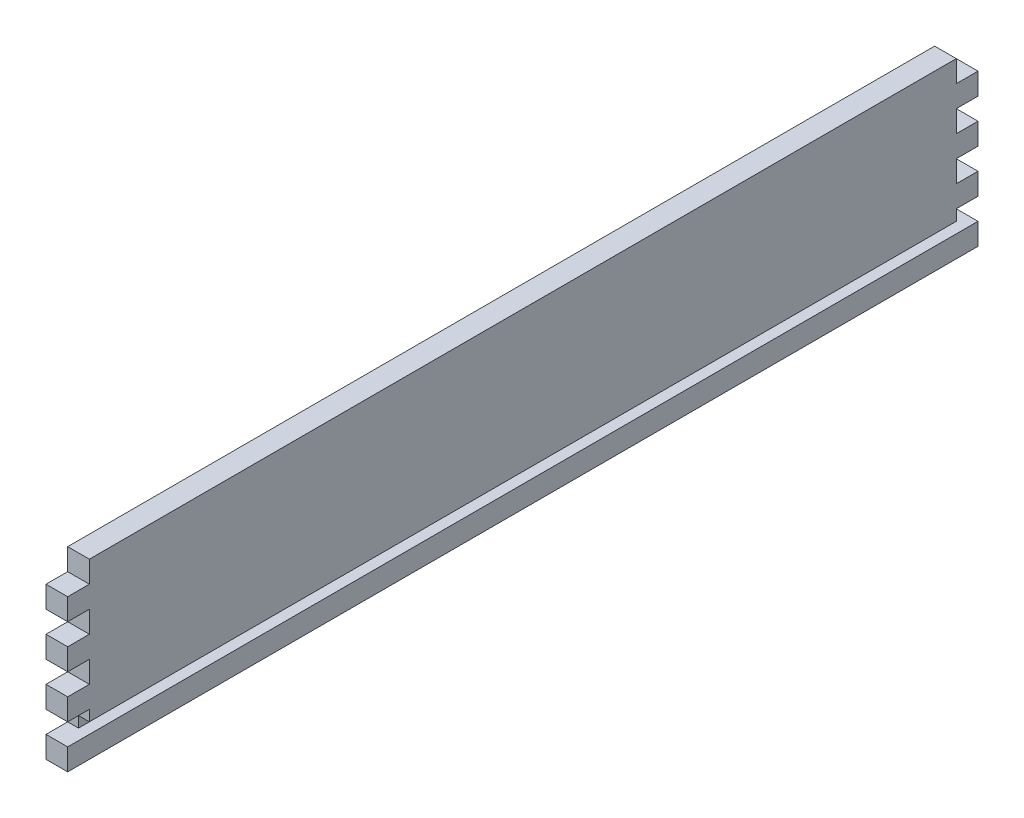
ISO-10303-21;
HEADER;
FILE_DESCRIPTION(('STEP AP214'),'2;1');
FILE_NAME('part.step','',(''),(''),'','','');
FILE_SCHEMA(('AUTOMOTIVE_DESIGN { 1 0 10303 214 1 1 1 1 }'));
ENDSEC;
DATA;
#1=APPLICATION_CONTEXT('core data for automotive mechanical design processes');
#2=APPLICATION_PROTOCOL_DEFINITION('international standard','automotive_design',2000,#1);
#3=PRODUCT_CONTEXT('',#1,'mechanical');
#4=PRODUCT('Part','Part','',(#3));
#5=PRODUCT_RELATED_PRODUCT_CATEGORY('part','',(#4));
#6=PRODUCT_DEFINITION_FORMATION('','',#4);
#7=PRODUCT_DEFINITION_CONTEXT('part definition',#1,'design');
#8=PRODUCT_DEFINITION('design','',#6,#7);
#9=PRODUCT_DEFINITION_SHAPE('','',#8);
#10=(LENGTH_UNIT() NAMED_UNIT(*) SI_UNIT(.MILLI.,.METRE.));
#11=(NAMED_UNIT(*) PLANE_ANGLE_UNIT() SI_UNIT($,.RADIAN.));
#12=(NAMED_UNIT(*) SI_UNIT($,.STERADIAN.) SOLID_ANGLE_UNIT());
#13=UNCERTAINTY_MEASURE_WITH_UNIT(LENGTH_MEASURE(1.E-05),#10,'distance_accuracy_value','');
#14=(GEOMETRIC_REPRESENTATION_CONTEXT(3) GLOBAL_UNCERTAINTY_ASSIGNED_CONTEXT((#13)) GLOBAL_UNIT_ASSIGNED_CONTEXT((#10,
#11,#12)) REPRESENTATION_CONTEXT('',''));
#15=CARTESIAN_POINT('',(0.,0.,0.));
#16=DIRECTION('',(0.,0.,1.));
#17=DIRECTION('',(1.,0.,0.));
#18=AXIS2_PLACEMENT_3D('',#15,#16,#17);
#19=CARTESIAN_POINT('',(12.7,0.,0.));
#20=DIRECTION('',(1.,0.,0.));
#21=DIRECTION('',(0.,0.,-1.));
#22=AXIS2_PLACEMENT_3D('',#19,#20,#21);
#23=PLANE('',#22);
#24=DIRECTION('',(0.,0.,1.));
#25=VECTOR('',#24,1.);
#26=CARTESIAN_POINT('',(12.7,19.05,0.));
#27=LINE('',#26,#25);
#28=CARTESIAN_POINT('',(12.7,19.05,-520.700000000001));
#29=VERTEX_POINT('',#28);
#30=CARTESIAN_POINT('',(12.7,19.05,-12.7000000000007));
#31=VERTEX_POINT('',#30);
#32=EDGE_CURVE('E42',#29,#31,#27,.T.);
#33=ORIENTED_EDGE('',*,*,#32,.F.);
#34=DIRECTION('',(0.,-1.,0.));
#35=VECTOR('',#34,1.);
#36=CARTESIAN_POINT('',(12.7,4.55191440096315E-12,-520.700000000001));
#37=LINE('',#36,#35);
#38=CARTESIAN_POINT('',(12.7,25.4,-520.700000000001));
#39=VERTEX_POINT('',#38);
#40=EDGE_CURVE('E270',#39,#29,#37,.T.);
#41=ORIENTED_EDGE('',*,*,#40,.F.);
#42=DIRECTION('',(0.,0.,-1.));
#43=VECTOR('',#42,1.);
#44=CARTESIAN_POINT('',(12.7,25.4,0.));
#45=LINE('',#44,#43);
#46=CARTESIAN_POINT('',(12.7,25.4,-533.400000000001));
#47=VERTEX_POINT('',#46);
#48=EDGE_CURVE('E363',#39,#47,#45,.T.);
#49=ORIENTED_EDGE('',*,*,#48,.T.);
#50=DIRECTION('',(0.,1.,0.));
#51=VECTOR('',#50,1.);
#52=CARTESIAN_POINT('',(12.7,4.66293670342566E-12,-533.400000000001));
#53=LINE('',#52,#51);
#54=CARTESIAN_POINT('',(12.7,38.1,-533.400000000001));
#55=VERTEX_POINT('',#54);
#56=EDGE_CURVE('E163',#47,#55,#53,.T.);
#57=ORIENTED_EDGE('',*,*,#56,.T.);
#58=DIRECTION('',(0.,0.,-1.));
#59=VECTOR('',#58,1.);
#60=CARTESIAN_POINT('',(12.7,38.1,0.));
#61=LINE('',#60,#59);
#62=CARTESIAN_POINT('',(12.7,38.1,-520.700000000001));
#63=VERTEX_POINT('',#62);
#64=EDGE_CURVE('E602',#63,#55,#61,.T.);
#65=ORIENTED_EDGE('',*,*,#64,.F.);
#66=DIRECTION('',(0.,-1.,0.));
#67=VECTOR('',#66,1.);
#68=CARTESIAN_POINT('',(12.7,4.55191440096315E-12,-520.700000000001));
#69=LINE('',#68,#67);
#70=CARTESIAN_POINT('',(12.7,50.8,-520.7));
#71=VERTEX_POINT('',#70);
#72=EDGE_CURVE('E596',#71,#63,#69,.T.);
#73=ORIENTED_EDGE('',*,*,#72,.F.);
#74=DIRECTION('',(0.,0.,-1.));
#75=VECTOR('',#74,1.);
#76=CARTESIAN_POINT('',(12.7,50.8,0.));
#77=LINE('',#76,#75);
#78=CARTESIAN_POINT('',(12.7,50.8,-533.4));
#79=VERTEX_POINT('',#78);
#80=EDGE_CURVE('E591',#71,#79,#77,.T.);
#81=ORIENTED_EDGE('',*,*,#80,.T.);
#82=DIRECTION('',(0.,1.,0.));
#83=VECTOR('',#82,1.);
#84=CARTESIAN_POINT('',(12.7,9.32587340685134E-12,-533.400000000001));
#85=LINE('',#84,#83);
#86=CARTESIAN_POINT('',(12.7,63.5,-533.4));
#87=VERTEX_POINT('',#86);
#88=EDGE_CURVE('E587',#79,#87,#85,.T.);
#89=ORIENTED_EDGE('',*,*,#88,.T.);
#90=DIRECTION('',(0.,0.,-1.));
#91=VECTOR('',#90,1.);
#92=CARTESIAN_POINT('',(12.7,63.5,0.));
#93=LINE('',#92,#91);
#94=CARTESIAN_POINT('',(12.7,63.5,-520.7));
#95=VERTEX_POINT('',#94);
#96=EDGE_CURVE('E651',#95,#87,#93,.T.);
#97=ORIENTED_EDGE('',*,*,#96,.F.);
#98=DIRECTION('',(0.,-1.,0.));
#99=VECTOR('',#98,1.);
#100=CARTESIAN_POINT('',(12.7,4.55191440096315E-12,-520.700000000001));
#101=LINE('',#100,#99);
#102=CARTESIAN_POINT('',(12.7,76.2,-520.7));
#103=VERTEX_POINT('',#102);
#104=EDGE_CURVE('E574',#103,#95,#101,.T.);
#105=ORIENTED_EDGE('',*,*,#104,.F.);
#106=DIRECTION('',(0.,0.,-1.));
#107=VECTOR('',#106,1.);
#108=CARTESIAN_POINT('',(12.7,76.2,0.));
#109=LINE('',#108,#107);
#110=CARTESIAN_POINT('',(12.7,76.2,-533.4));
#111=VERTEX_POINT('',#110);
#112=EDGE_CURVE('E654',#103,#111,#109,.T.);
#113=ORIENTED_EDGE('',*,*,#112,.T.);
#114=DIRECTION('',(0.,1.,0.));
#115=VECTOR('',#114,1.);
#116=CARTESIAN_POINT('',(12.7,4.66293670342566E-12,-533.400000000001));
#117=LINE('',#116,#115);
#118=CARTESIAN_POINT('',(12.7,88.9,-533.4));
#119=VERTEX_POINT('',#118);
#120=EDGE_CURVE('E656',#111,#119,#117,.T.);
#121=ORIENTED_EDGE('',*,*,#120,.T.);
#122=DIRECTION('',(0.,0.,-1.));
#123=VECTOR('',#122,1.);
#124=CARTESIAN_POINT('',(12.7,88.9,0.));
#125=LINE('',#124,#123);
#126=CARTESIAN_POINT('',(12.7,88.9,-520.7));
#127=VERTEX_POINT('',#126);
#128=EDGE_CURVE('E560',#127,#119,#125,.T.);
#129=ORIENTED_EDGE('',*,*,#128,.F.);
#130=DIRECTION('',(0.,-1.,0.));
#131=VECTOR('',#130,1.);
#132=CARTESIAN_POINT('',(12.7,0.,-520.7));
#133=LINE('',#132,#131);
#134=CARTESIAN_POINT('',(12.7,101.6,-520.7));
#135=VERTEX_POINT('',#134);
#136=EDGE_CURVE('E554',#135,#127,#133,.T.);
#137=ORIENTED_EDGE('',*,*,#136,.F.);
#138=DIRECTION('',(0.,0.,-1.));
#139=VECTOR('',#138,1.);
#140=CARTESIAN_POINT('',(12.7,101.6,0.));
#141=LINE('',#140,#139);
#142=CARTESIAN_POINT('',(12.7,101.6,-12.7));
#143=VERTEX_POINT('',#142);
#144=EDGE_CURVE('E546',#143,#135,#141,.T.);
#145=ORIENTED_EDGE('',*,*,#144,.F.);
#146=DIRECTION('',(0.,-1.,0.));
#147=VECTOR('',#146,1.);
#148=CARTESIAN_POINT('',(12.7,0.,-12.7));
#149=LINE('',#148,#147);
#150=CARTESIAN_POINT('',(12.7,88.9,-12.7));
#151=VERTEX_POINT('',#150);
#152=EDGE_CURVE('E541',#143,#151,#149,.T.);
#153=ORIENTED_EDGE('',*,*,#152,.T.);
#154=DIRECTION('',(0.,0.,1.));
#155=VECTOR('',#154,1.);
#156=CARTESIAN_POINT('',(12.7,88.9,0.));
#157=LINE('',#156,#155);
#158=CARTESIAN_POINT('',(12.7,88.9,0.));
#159=VERTEX_POINT('',#158);
#160=EDGE_CURVE('E537',#151,#159,#157,.T.);
#161=ORIENTED_EDGE('',*,*,#160,.T.);
#162=DIRECTION('',(0.,1.,0.));
#163=VECTOR('',#162,1.);
#164=CARTESIAN_POINT('',(12.7,0.,-9.31178073069463E-13));
#165=LINE('',#164,#163);
#166=CARTESIAN_POINT('',(12.7,76.2,-1.33025439105324E-13));
#167=VERTEX_POINT('',#166);
#168=EDGE_CURVE('E663',#167,#159,#165,.T.);
#169=ORIENTED_EDGE('',*,*,#168,.F.);
#170=DIRECTION('',(0.,0.,1.));
#171=VECTOR('',#170,1.);
#172=CARTESIAN_POINT('',(12.7,76.2,0.));
#173=LINE('',#172,#171);
#174=CARTESIAN_POINT('',(12.7,76.2,-12.7000000000001));
#175=VERTEX_POINT('',#174);
#176=EDGE_CURVE('E524',#175,#167,#173,.T.);
#177=ORIENTED_EDGE('',*,*,#176,.F.);
#178=DIRECTION('',(0.,-1.,0.));
#179=VECTOR('',#178,1.);
#180=CARTESIAN_POINT('',(12.7,1.31838984174247E-13,-12.7000000000009));
#181=LINE('',#180,#179);
#182=CARTESIAN_POINT('',(12.7,63.5,-12.7000000000003));
#183=VERTEX_POINT('',#182);
#184=EDGE_CURVE('E517',#175,#183,#181,.T.);
#185=ORIENTED_EDGE('',*,*,#184,.T.);
#186=DIRECTION('',(0.,0.,1.));
#187=VECTOR('',#186,1.);
#188=CARTESIAN_POINT('',(12.7,63.5,0.));
#189=LINE('',#188,#187);
#190=CARTESIAN_POINT('',(12.7,63.5,-2.66050878210648E-13));
#191=VERTEX_POINT('',#190);
#192=EDGE_CURVE('E513',#183,#191,#189,.T.);
#193=ORIENTED_EDGE('',*,*,#192,.T.);
#194=DIRECTION('',(0.,1.,0.));
#195=VECTOR('',#194,1.);
#196=CARTESIAN_POINT('',(12.7,0.,-9.31178073069463E-13));
#197=LINE('',#196,#195);
#198=CARTESIAN_POINT('',(12.7,50.8,-3.99076317315973E-13));
#199=VERTEX_POINT('',#198);
#200=EDGE_CURVE('E508',#199,#191,#197,.T.);
#201=ORIENTED_EDGE('',*,*,#200,.F.);
#202=DIRECTION('',(0.,0.,1.));
#203=VECTOR('',#202,1.);
#204=CARTESIAN_POINT('',(12.7,50.8,0.));
#205=LINE('',#204,#203);
#206=CARTESIAN_POINT('',(12.7,50.8,-12.7000000000004));
#207=VERTEX_POINT('',#206);
#208=EDGE_CURVE('E499',#207,#199,#205,.T.);
#209=ORIENTED_EDGE('',*,*,#208,.F.);
#210=DIRECTION('',(0.,-1.,0.));
#211=VECTOR('',#210,1.);
#212=CARTESIAN_POINT('',(12.7,1.33573707650224E-13,-12.7000000000009));
#213=LINE('',#212,#211);
#214=CARTESIAN_POINT('',(12.7,38.1,-12.7000000000005));
#215=VERTEX_POINT('',#214);
#216=EDGE_CURVE('E494',#207,#215,#213,.T.);
#217=ORIENTED_EDGE('',*,*,#216,.T.);
#218=DIRECTION('',(0.,0.,1.));
#219=VECTOR('',#218,1.);
#220=CARTESIAN_POINT('',(12.7,38.1,0.));
#221=LINE('',#220,#219);
#222=CARTESIAN_POINT('',(12.7,38.1,-5.32101756421297E-13));
#223=VERTEX_POINT('',#222);
#224=EDGE_CURVE('E490',#215,#223,#221,.T.);
#225=ORIENTED_EDGE('',*,*,#224,.T.);
#226=DIRECTION('',(0.,1.,0.));
#227=VECTOR('',#226,1.);
#228=CARTESIAN_POINT('',(12.7,0.,-9.31178073069464E-13));
#229=LINE('',#228,#227);
#230=CARTESIAN_POINT('',(12.7,25.4,-6.65127195526621E-13));
#231=VERTEX_POINT('',#230);
#232=EDGE_CURVE('E460',#231,#223,#229,.T.);
#233=ORIENTED_EDGE('',*,*,#232,.F.);
#234=DIRECTION('',(0.,0.,1.));
#235=VECTOR('',#234,1.);
#236=CARTESIAN_POINT('',(12.7,25.4,0.));
#237=LINE('',#236,#235);
#238=CARTESIAN_POINT('',(12.7,25.4,-12.7000000000007));
#239=VERTEX_POINT('',#238);
#240=EDGE_CURVE('E456',#239,#231,#237,.T.);
#241=ORIENTED_EDGE('',*,*,#240,.F.);
#242=DIRECTION('',(0.,-1.,0.));
#243=VECTOR('',#242,1.);
#244=CARTESIAN_POINT('',(12.7,1.33573707650224E-13,-12.7000000000009));
#245=LINE('',#244,#243);
#246=EDGE_CURVE('E449',#239,#31,#245,.T.);
#247=ORIENTED_EDGE('',*,*,#246,.T.);
#248=EDGE_LOOP('',(#33,#41,#49,#57,#65,#73,#81,#89,#97,#105,#113,#121,#129,#137,#145,#153,#161,
#169,#177,#185,#193,#201,#209,#217,#225,#233,#241,#247));
#249=FACE_BOUND('',#248,.T.);
#250=ADVANCED_FACE('F33',(#249),#23,.T.);
#251=CARTESIAN_POINT('',(12.7,25.4,0.));
#252=DIRECTION('',(0.,1.,0.));
#253=DIRECTION('',(0.,0.,1.));
#254=AXIS2_PLACEMENT_3D('',#251,#252,#253);
#255=PLANE('',#254);
#256=DIRECTION('',(0.,0.,-1.));
#257=VECTOR('',#256,1.);
#258=CARTESIAN_POINT('',(0.,25.4,0.));
#259=LINE('',#258,#257);
#260=CARTESIAN_POINT('',(0.,25.4,-520.700000000001));
#261=VERTEX_POINT('',#260);
#262=CARTESIAN_POINT('',(0.,25.4,-533.400000000001));
#263=VERTEX_POINT('',#262);
#264=EDGE_CURVE('E275',#261,#263,#259,.T.);
#265=ORIENTED_EDGE('',*,*,#264,.T.);
#266=DIRECTION('',(-1.,0.,0.));
#267=VECTOR('',#266,1.);
#268=CARTESIAN_POINT('',(12.7,25.4,-533.400000000001));
#269=LINE('',#268,#267);
#270=EDGE_CURVE('E425',#47,#263,#269,.T.);
#271=ORIENTED_EDGE('',*,*,#270,.F.);
#272=ORIENTED_EDGE('',*,*,#48,.F.);
#273=DIRECTION('',(-1.,0.,0.));
#274=VECTOR('',#273,1.);
#275=CARTESIAN_POINT('',(12.7,25.4,-520.700000000001));
#276=LINE('',#275,#274);
#277=EDGE_CURVE('E50',#39,#261,#276,.T.);
#278=ORIENTED_EDGE('',*,*,#277,.T.);
#279=EDGE_LOOP('',(#265,#271,#272,#278));
#280=FACE_BOUND('',#279,.T.);
#281=ADVANCED_FACE('F35',(#280),#255,.F.);
#282=CARTESIAN_POINT('',(12.7,4.66293670342566E-12,-533.400000000001));
#283=DIRECTION('',(0.,0.,1.));
#284=DIRECTION('',(0.,-1.,0.));
#285=AXIS2_PLACEMENT_3D('',#282,#283,#284);
#286=PLANE('',#285);
#287=DIRECTION('',(0.,1.,0.));
#288=VECTOR('',#287,1.);
#289=CARTESIAN_POINT('',(0.,4.66293670342566E-12,-533.400000000001));
#290=LINE('',#289,#288);
#291=CARTESIAN_POINT('',(0.,38.1,-533.400000000001));
#292=VERTEX_POINT('',#291);
#293=EDGE_CURVE('E277',#263,#292,#290,.T.);
#294=ORIENTED_EDGE('',*,*,#293,.T.);
#295=DIRECTION('',(-1.,0.,0.));
#296=VECTOR('',#295,1.);
#297=CARTESIAN_POINT('',(12.7,38.1,-533.400000000001));
#298=LINE('',#297,#296);
#299=EDGE_CURVE('E423',#55,#292,#298,.T.);
#300=ORIENTED_EDGE('',*,*,#299,.F.);
#301=ORIENTED_EDGE('',*,*,#56,.F.);
#302=ORIENTED_EDGE('',*,*,#270,.T.);
#303=EDGE_LOOP('',(#294,#300,#301,#302));
#304=FACE_BOUND('',#303,.T.);
#305=ADVANCED_FACE('F603',(#304),#286,.F.);
#306=CARTESIAN_POINT('',(12.7,38.1,0.));
#307=DIRECTION('',(0.,1.,0.));
#308=DIRECTION('',(0.,0.,1.));
#309=AXIS2_PLACEMENT_3D('',#306,#307,#308);
#310=PLANE('',#309);
#311=DIRECTION('',(0.,0.,-1.));
#312=VECTOR('',#311,1.);
#313=CARTESIAN_POINT('',(0.,38.1,0.));
#314=LINE('',#313,#312);
#315=CARTESIAN_POINT('',(0.,38.1,-520.700000000001));
#316=VERTEX_POINT('',#315);
#317=EDGE_CURVE('E281',#316,#292,#314,.T.);
#318=ORIENTED_EDGE('',*,*,#317,.F.);
#319=DIRECTION('',(-1.,0.,0.));
#320=VECTOR('',#319,1.);
#321=CARTESIAN_POINT('',(12.7,38.1,-520.700000000001));
#322=LINE('',#321,#320);
#323=EDGE_CURVE('E421',#63,#316,#322,.T.);
#324=ORIENTED_EDGE('',*,*,#323,.F.);
#325=ORIENTED_EDGE('',*,*,#64,.T.);
#326=ORIENTED_EDGE('',*,*,#299,.T.);
#327=EDGE_LOOP('',(#318,#324,#325,#326));
#328=FACE_BOUND('',#327,.T.);
#329=ADVANCED_FACE('F599',(#328),#310,.T.);
#330=CARTESIAN_POINT('',(12.7,4.55191440096315E-12,-520.700000000001));
#331=DIRECTION('',(0.,0.,-1.));
#332=DIRECTION('',(0.,1.,0.));
#333=AXIS2_PLACEMENT_3D('',#330,#331,#332);
#334=PLANE('',#333);
#335=DIRECTION('',(0.,-1.,0.));
#336=VECTOR('',#335,1.);
#337=CARTESIAN_POINT('',(0.,4.55191440096315E-12,-520.700000000001));
#338=LINE('',#337,#336);
#339=CARTESIAN_POINT('',(0.,50.8,-520.7));
#340=VERTEX_POINT('',#339);
#341=EDGE_CURVE('E284',#340,#316,#338,.T.);
#342=ORIENTED_EDGE('',*,*,#341,.F.);
#343=DIRECTION('',(-1.,0.,0.));
#344=VECTOR('',#343,1.);
#345=CARTESIAN_POINT('',(12.7,50.8,-520.7));
#346=LINE('',#345,#344);
#347=EDGE_CURVE('E419',#71,#340,#346,.T.);
#348=ORIENTED_EDGE('',*,*,#347,.F.);
#349=ORIENTED_EDGE('',*,*,#72,.T.);
#350=ORIENTED_EDGE('',*,*,#323,.T.);
#351=EDGE_LOOP('',(#342,#348,#349,#350));
#352=FACE_BOUND('',#351,.T.);
#353=ADVANCED_FACE('F595',(#352),#334,.T.);
#354=CARTESIAN_POINT('',(12.7,50.8,0.));
#355=DIRECTION('',(0.,1.,0.));
#356=DIRECTION('',(0.,0.,1.));
#357=AXIS2_PLACEMENT_3D('',#354,#355,#356);
#358=PLANE('',#357);
#359=DIRECTION('',(0.,0.,-1.));
#360=VECTOR('',#359,1.);
#361=CARTESIAN_POINT('',(0.,50.8,0.));
#362=LINE('',#361,#360);
#363=CARTESIAN_POINT('',(0.,50.8,-533.4));
#364=VERTEX_POINT('',#363);
#365=EDGE_CURVE('E287',#340,#364,#362,.T.);
#366=ORIENTED_EDGE('',*,*,#365,.T.);
#367=DIRECTION('',(-1.,0.,0.));
#368=VECTOR('',#367,1.);
#369=CARTESIAN_POINT('',(12.7,50.8,-533.4));
#370=LINE('',#369,#368);
#371=EDGE_CURVE('E416',#79,#364,#370,.T.);
#372=ORIENTED_EDGE('',*,*,#371,.F.);
#373=ORIENTED_EDGE('',*,*,#80,.F.);
#374=ORIENTED_EDGE('',*,*,#347,.T.);
#375=EDGE_LOOP('',(#366,#372,#373,#374));
#376=FACE_BOUND('',#375,.T.);
#377=ADVANCED_FACE('F590',(#376),#358,.F.);
#378=CARTESIAN_POINT('',(12.7,9.32587340685134E-12,-533.400000000001));
#379=DIRECTION('',(0.,0.,1.));
#380=DIRECTION('',(0.,-1.,0.));
#381=AXIS2_PLACEMENT_3D('',#378,#379,#380);
#382=PLANE('',#381);
#383=DIRECTION('',(0.,1.,0.));
#384=VECTOR('',#383,1.);
#385=CARTESIAN_POINT('',(0.,9.32587340685134E-12,-533.400000000001));
#386=LINE('',#385,#384);
#387=CARTESIAN_POINT('',(0.,63.5,-533.4));
#388=VERTEX_POINT('',#387);
#389=EDGE_CURVE('E289',#364,#388,#386,.T.);
#390=ORIENTED_EDGE('',*,*,#389,.T.);
#391=DIRECTION('',(-1.,0.,0.));
#392=VECTOR('',#391,1.);
#393=CARTESIAN_POINT('',(12.7,63.5,-533.4));
#394=LINE('',#393,#392);
#395=EDGE_CURVE('E414',#87,#388,#394,.T.);
#396=ORIENTED_EDGE('',*,*,#395,.F.);
#397=ORIENTED_EDGE('',*,*,#88,.F.);
#398=ORIENTED_EDGE('',*,*,#371,.T.);
#399=EDGE_LOOP('',(#390,#396,#397,#398));
#400=FACE_BOUND('',#399,.T.);
#401=ADVANCED_FACE('F584',(#400),#382,.F.);
#402=CARTESIAN_POINT('',(12.7,63.5,0.));
#403=DIRECTION('',(0.,1.,0.));
#404=DIRECTION('',(0.,0.,1.));
#405=AXIS2_PLACEMENT_3D('',#402,#403,#404);
#406=PLANE('',#405);
#407=DIRECTION('',(0.,0.,-1.));
#408=VECTOR('',#407,1.);
#409=CARTESIAN_POINT('',(0.,63.5,0.));
#410=LINE('',#409,#408);
#411=CARTESIAN_POINT('',(0.,63.5,-520.7));
#412=VERTEX_POINT('',#411);
#413=EDGE_CURVE('E292',#412,#388,#410,.T.);
#414=ORIENTED_EDGE('',*,*,#413,.F.);
#415=DIRECTION('',(-1.,0.,0.));
#416=VECTOR('',#415,1.);
#417=CARTESIAN_POINT('',(12.7,63.5,-520.7));
#418=LINE('',#417,#416);
#419=EDGE_CURVE('E412',#95,#412,#418,.T.);
#420=ORIENTED_EDGE('',*,*,#419,.F.);
#421=ORIENTED_EDGE('',*,*,#96,.T.);
#422=ORIENTED_EDGE('',*,*,#395,.T.);
#423=EDGE_LOOP('',(#414,#420,#421,#422));
#424=FACE_BOUND('',#423,.T.);
#425=ADVANCED_FACE('F578',(#424),#406,.T.);
#426=CARTESIAN_POINT('',(12.7,4.55191440096315E-12,-520.700000000001));
#427=DIRECTION('',(0.,0.,-1.));
#428=DIRECTION('',(0.,1.,0.));
#429=AXIS2_PLACEMENT_3D('',#426,#427,#428);
#430=PLANE('',#429);
#431=DIRECTION('',(0.,-1.,0.));
#432=VECTOR('',#431,1.);
#433=CARTESIAN_POINT('',(0.,4.55191440096315E-12,-520.700000000001));
#434=LINE('',#433,#432);
#435=CARTESIAN_POINT('',(0.,76.2,-520.7));
#436=VERTEX_POINT('',#435);
#437=EDGE_CURVE('E295',#436,#412,#434,.T.);
#438=ORIENTED_EDGE('',*,*,#437,.F.);
#439=DIRECTION('',(-1.,0.,0.));
#440=VECTOR('',#439,1.);
#441=CARTESIAN_POINT('',(12.7,76.2,-520.7));
#442=LINE('',#441,#440);
#443=EDGE_CURVE('E410',#103,#436,#442,.T.);
#444=ORIENTED_EDGE('',*,*,#443,.F.);
#445=ORIENTED_EDGE('',*,*,#104,.T.);
#446=ORIENTED_EDGE('',*,*,#419,.T.);
#447=EDGE_LOOP('',(#438,#444,#445,#446));
#448=FACE_BOUND('',#447,.T.);
#449=ADVANCED_FACE('F569',(#448),#430,.T.);
#450=CARTESIAN_POINT('',(12.7,76.2,0.));
#451=DIRECTION('',(0.,1.,0.));
#452=DIRECTION('',(0.,0.,1.));
#453=AXIS2_PLACEMENT_3D('',#450,#451,#452);
#454=PLANE('',#453);
#455=DIRECTION('',(0.,0.,-1.));
#456=VECTOR('',#455,1.);
#457=CARTESIAN_POINT('',(0.,76.2,0.));
#458=LINE('',#457,#456);
#459=CARTESIAN_POINT('',(0.,76.2,-533.4));
#460=VERTEX_POINT('',#459);
#461=EDGE_CURVE('E298',#436,#460,#458,.T.);
#462=ORIENTED_EDGE('',*,*,#461,.T.);
#463=DIRECTION('',(-1.,0.,0.));
#464=VECTOR('',#463,1.);
#465=CARTESIAN_POINT('',(12.7,76.2,-533.4));
#466=LINE('',#465,#464);
#467=EDGE_CURVE('E407',#111,#460,#466,.T.);
#468=ORIENTED_EDGE('',*,*,#467,.F.);
#469=ORIENTED_EDGE('',*,*,#112,.F.);
#470=ORIENTED_EDGE('',*,*,#443,.T.);
#471=EDGE_LOOP('',(#462,#468,#469,#470));
#472=FACE_BOUND('',#471,.T.);
#473=ADVANCED_FACE('F671',(#472),#454,.F.);
#474=CARTESIAN_POINT('',(12.7,4.66293670342566E-12,-533.400000000001));
#475=DIRECTION('',(0.,0.,1.));
#476=DIRECTION('',(0.,-1.,0.));
#477=AXIS2_PLACEMENT_3D('',#474,#475,#476);
#478=PLANE('',#477);
#479=DIRECTION('',(0.,1.,0.));
#480=VECTOR('',#479,1.);
#481=CARTESIAN_POINT('',(0.,4.66293670342566E-12,-533.400000000001));
#482=LINE('',#481,#480);
#483=CARTESIAN_POINT('',(0.,88.9,-533.4));
#484=VERTEX_POINT('',#483);
#485=EDGE_CURVE('E300',#460,#484,#482,.T.);
#486=ORIENTED_EDGE('',*,*,#485,.T.);
#487=DIRECTION('',(-1.,0.,0.));
#488=VECTOR('',#487,1.);
#489=CARTESIAN_POINT('',(12.7,88.9,-533.4));
#490=LINE('',#489,#488);
#491=EDGE_CURVE('E405',#119,#484,#490,.T.);
#492=ORIENTED_EDGE('',*,*,#491,.F.);
#493=ORIENTED_EDGE('',*,*,#120,.F.);
#494=ORIENTED_EDGE('',*,*,#467,.T.);
#495=EDGE_LOOP('',(#486,#492,#493,#494));
#496=FACE_BOUND('',#495,.T.);
#497=ADVANCED_FACE('F563',(#496),#478,.F.);
#498=CARTESIAN_POINT('',(12.7,88.9,0.));
#499=DIRECTION('',(0.,1.,0.));
#500=DIRECTION('',(0.,0.,1.));
#501=AXIS2_PLACEMENT_3D('',#498,#499,#500);
#502=PLANE('',#501);
#503=DIRECTION('',(0.,0.,-1.));
#504=VECTOR('',#503,1.);
#505=CARTESIAN_POINT('',(0.,88.9,0.));
#506=LINE('',#505,#504);
#507=CARTESIAN_POINT('',(0.,88.9,-520.7));
#508=VERTEX_POINT('',#507);
#509=EDGE_CURVE('E303',#508,#484,#506,.T.);
#510=ORIENTED_EDGE('',*,*,#509,.F.);
#511=DIRECTION('',(-1.,0.,0.));
#512=VECTOR('',#511,1.);
#513=CARTESIAN_POINT('',(12.7,88.9,-520.7));
#514=LINE('',#513,#512);
#515=EDGE_CURVE('E403',#127,#508,#514,.T.);
#516=ORIENTED_EDGE('',*,*,#515,.F.);
#517=ORIENTED_EDGE('',*,*,#128,.T.);
#518=ORIENTED_EDGE('',*,*,#491,.T.);
#519=EDGE_LOOP('',(#510,#516,#517,#518));
#520=FACE_BOUND('',#519,.T.);
#521=ADVANCED_FACE('F558',(#520),#502,.T.);
#522=CARTESIAN_POINT('',(12.7,0.,-520.7));
#523=DIRECTION('',(0.,0.,-1.));
#524=DIRECTION('',(-1.,0.,0.));
#525=AXIS2_PLACEMENT_3D('',#522,#523,#524);
#526=PLANE('',#525);
#527=DIRECTION('',(0.,-1.,0.));
#528=VECTOR('',#527,1.);
#529=CARTESIAN_POINT('',(0.,0.,-520.7));
#530=LINE('',#529,#528);
#531=CARTESIAN_POINT('',(0.,101.6,-520.7));
#532=VERTEX_POINT('',#531);
#533=EDGE_CURVE('E306',#532,#508,#530,.T.);
#534=ORIENTED_EDGE('',*,*,#533,.F.);
#535=DIRECTION('',(-1.,0.,0.));
#536=VECTOR('',#535,1.);
#537=CARTESIAN_POINT('',(12.7,101.6,-520.7));
#538=LINE('',#537,#536);
#539=EDGE_CURVE('E401',#135,#532,#538,.T.);
#540=ORIENTED_EDGE('',*,*,#539,.F.);
#541=ORIENTED_EDGE('',*,*,#136,.T.);
#542=ORIENTED_EDGE('',*,*,#515,.T.);
#543=EDGE_LOOP('',(#534,#540,#541,#542));
#544=FACE_BOUND('',#543,.T.);
#545=ADVANCED_FACE('F551',(#544),#526,.T.);
#546=CARTESIAN_POINT('',(12.7,101.6,0.));
#547=DIRECTION('',(0.,1.,0.));
#548=DIRECTION('',(0.,0.,1.));
#549=AXIS2_PLACEMENT_3D('',#546,#547,#548);
#550=PLANE('',#549);
#551=DIRECTION('',(0.,0.,-1.));
#552=VECTOR('',#551,1.);
#553=CARTESIAN_POINT('',(0.,101.6,0.));
#554=LINE('',#553,#552);
#555=CARTESIAN_POINT('',(0.,101.6,-12.7));
#556=VERTEX_POINT('',#555);
#557=EDGE_CURVE('E309',#556,#532,#554,.T.);
#558=ORIENTED_EDGE('',*,*,#557,.F.);
#559=DIRECTION('',(-1.,0.,0.));
#560=VECTOR('',#559,1.);
#561=CARTESIAN_POINT('',(12.7,101.6,-12.7));
#562=LINE('',#561,#560);
#563=EDGE_CURVE('E399',#143,#556,#562,.T.);
#564=ORIENTED_EDGE('',*,*,#563,.F.);
#565=ORIENTED_EDGE('',*,*,#144,.T.);
#566=ORIENTED_EDGE('',*,*,#539,.T.);
#567=EDGE_LOOP('',(#558,#564,#565,#566));
#568=FACE_BOUND('',#567,.T.);
#569=ADVANCED_FACE('F545',(#568),#550,.T.);
#570=CARTESIAN_POINT('',(12.7,0.,-12.7));
#571=DIRECTION('',(0.,0.,-1.));
#572=DIRECTION('',(0.,1.,0.));
#573=AXIS2_PLACEMENT_3D('',#570,#571,#572);
#574=PLANE('',#573);
#575=DIRECTION('',(0.,-1.,0.));
#576=VECTOR('',#575,1.);
#577=CARTESIAN_POINT('',(0.,0.,-12.7));
#578=LINE('',#577,#576);
#579=CARTESIAN_POINT('',(0.,88.9,-12.7));
#580=VERTEX_POINT('',#579);
#581=EDGE_CURVE('E312',#556,#580,#578,.T.);
#582=ORIENTED_EDGE('',*,*,#581,.T.);
#583=DIRECTION('',(-1.,0.,0.));
#584=VECTOR('',#583,1.);
#585=CARTESIAN_POINT('',(12.7,88.9,-12.7));
#586=LINE('',#585,#584);
#587=EDGE_CURVE('E396',#151,#580,#586,.T.);
#588=ORIENTED_EDGE('',*,*,#587,.F.);
#589=ORIENTED_EDGE('',*,*,#152,.F.);
#590=ORIENTED_EDGE('',*,*,#563,.T.);
#591=EDGE_LOOP('',(#582,#588,#589,#590));
#592=FACE_BOUND('',#591,.T.);
#593=ADVANCED_FACE('F540',(#592),#574,.F.);
#594=CARTESIAN_POINT('',(12.7,88.9,0.));
#595=DIRECTION('',(0.,-1.,0.));
#596=DIRECTION('',(0.,0.,-1.));
#597=AXIS2_PLACEMENT_3D('',#594,#595,#596);
#598=PLANE('',#597);
#599=DIRECTION('',(0.,0.,1.));
#600=VECTOR('',#599,1.);
#601=CARTESIAN_POINT('',(0.,88.9,0.));
#602=LINE('',#601,#600);
#603=CARTESIAN_POINT('',(0.,88.9,0.));
#604=VERTEX_POINT('',#603);
#605=EDGE_CURVE('E314',#580,#604,#602,.T.);
#606=ORIENTED_EDGE('',*,*,#605,.T.);
#607=DIRECTION('',(-1.,0.,0.));
#608=VECTOR('',#607,1.);
#609=CARTESIAN_POINT('',(12.7,88.9,0.));
#610=LINE('',#609,#608);
#611=EDGE_CURVE('E394',#159,#604,#610,.T.);
#612=ORIENTED_EDGE('',*,*,#611,.F.);
#613=ORIENTED_EDGE('',*,*,#160,.F.);
#614=ORIENTED_EDGE('',*,*,#587,.T.);
#615=EDGE_LOOP('',(#606,#612,#613,#614));
#616=FACE_BOUND('',#615,.T.);
#617=ADVANCED_FACE('F534',(#616),#598,.F.);
#618=CARTESIAN_POINT('',(12.7,0.,-9.31178073069463E-13));
#619=DIRECTION('',(0.,0.,1.));
#620=DIRECTION('',(0.,-1.,0.));
#621=AXIS2_PLACEMENT_3D('',#618,#619,#620);
#622=PLANE('',#621);
#623=DIRECTION('',(0.,1.,0.));
#624=VECTOR('',#623,1.);
#625=CARTESIAN_POINT('',(0.,0.,-9.31178073069463E-13));
#626=LINE('',#625,#624);
#627=CARTESIAN_POINT('',(0.,76.2,-1.33025439105324E-13));
#628=VERTEX_POINT('',#627);
#629=EDGE_CURVE('E317',#628,#604,#626,.T.);
#630=ORIENTED_EDGE('',*,*,#629,.F.);
#631=DIRECTION('',(-1.,0.,0.));
#632=VECTOR('',#631,1.);
#633=CARTESIAN_POINT('',(12.7,76.2,-1.33025439105324E-13));
#634=LINE('',#633,#632);
#635=EDGE_CURVE('E392',#167,#628,#634,.T.);
#636=ORIENTED_EDGE('',*,*,#635,.F.);
#637=ORIENTED_EDGE('',*,*,#168,.T.);
#638=ORIENTED_EDGE('',*,*,#611,.T.);
#639=EDGE_LOOP('',(#630,#636,#637,#638));
#640=FACE_BOUND('',#639,.T.);
#641=ADVANCED_FACE('F528',(#640),#622,.T.);
#642=CARTESIAN_POINT('',(12.7,76.2,0.));
#643=DIRECTION('',(0.,-1.,0.));
#644=DIRECTION('',(0.,0.,-1.));
#645=AXIS2_PLACEMENT_3D('',#642,#643,#644);
#646=PLANE('',#645);
#647=DIRECTION('',(0.,0.,1.));
#648=VECTOR('',#647,1.);
#649=CARTESIAN_POINT('',(0.,76.2,0.));
#650=LINE('',#649,#648);
#651=CARTESIAN_POINT('',(0.,76.2,-12.7000000000001));
#652=VERTEX_POINT('',#651);
#653=EDGE_CURVE('E320',#652,#628,#650,.T.);
#654=ORIENTED_EDGE('',*,*,#653,.F.);
#655=DIRECTION('',(-1.,0.,0.));
#656=VECTOR('',#655,1.);
#657=CARTESIAN_POINT('',(12.7,76.2,-12.7000000000001));
#658=LINE('',#657,#656);
#659=EDGE_CURVE('E390',#175,#652,#658,.T.);
#660=ORIENTED_EDGE('',*,*,#659,.F.);
#661=ORIENTED_EDGE('',*,*,#176,.T.);
#662=ORIENTED_EDGE('',*,*,#635,.T.);
#663=EDGE_LOOP('',(#654,#660,#661,#662));
#664=FACE_BOUND('',#663,.T.);
#665=ADVANCED_FACE('F521',(#664),#646,.T.);
#666=CARTESIAN_POINT('',(12.7,1.31838984174247E-13,-12.7000000000009));
#667=DIRECTION('',(0.,0.,-1.));
#668=DIRECTION('',(0.,1.,0.));
#669=AXIS2_PLACEMENT_3D('',#666,#667,#668);
#670=PLANE('',#669);
#671=DIRECTION('',(0.,-1.,0.));
#672=VECTOR('',#671,1.);
#673=CARTESIAN_POINT('',(0.,1.31838984174247E-13,-12.7000000000009));
#674=LINE('',#673,#672);
#675=CARTESIAN_POINT('',(0.,63.5,-12.7000000000003));
#676=VERTEX_POINT('',#675);
#677=EDGE_CURVE('E323',#652,#676,#674,.T.);
#678=ORIENTED_EDGE('',*,*,#677,.T.);
#679=DIRECTION('',(-1.,0.,0.));
#680=VECTOR('',#679,1.);
#681=CARTESIAN_POINT('',(12.7,63.5,-12.7000000000003));
#682=LINE('',#681,#680);
#683=EDGE_CURVE('E387',#183,#676,#682,.T.);
#684=ORIENTED_EDGE('',*,*,#683,.F.);
#685=ORIENTED_EDGE('',*,*,#184,.F.);
#686=ORIENTED_EDGE('',*,*,#659,.T.);
#687=EDGE_LOOP('',(#678,#684,#685,#686));
#688=FACE_BOUND('',#687,.T.);
#689=ADVANCED_FACE('F516',(#688),#670,.F.);
#690=CARTESIAN_POINT('',(12.7,63.5,0.));
#691=DIRECTION('',(0.,-1.,0.));
#692=DIRECTION('',(0.,0.,-1.));
#693=AXIS2_PLACEMENT_3D('',#690,#691,#692);
#694=PLANE('',#693);
#695=DIRECTION('',(0.,0.,1.));
#696=VECTOR('',#695,1.);
#697=CARTESIAN_POINT('',(0.,63.5,0.));
#698=LINE('',#697,#696);
#699=CARTESIAN_POINT('',(0.,63.5,-2.66050878210648E-13));
#700=VERTEX_POINT('',#699);
#701=EDGE_CURVE('E325',#676,#700,#698,.T.);
#702=ORIENTED_EDGE('',*,*,#701,.T.);
#703=DIRECTION('',(-1.,0.,0.));
#704=VECTOR('',#703,1.);
#705=CARTESIAN_POINT('',(12.7,63.5,-2.66050878210648E-13));
#706=LINE('',#705,#704);
#707=EDGE_CURVE('E385',#191,#700,#706,.T.);
#708=ORIENTED_EDGE('',*,*,#707,.F.);
#709=ORIENTED_EDGE('',*,*,#192,.F.);
#710=ORIENTED_EDGE('',*,*,#683,.T.);
#711=EDGE_LOOP('',(#702,#708,#709,#710));
#712=FACE_BOUND('',#711,.T.);
#713=ADVANCED_FACE('F511',(#712),#694,.F.);
#714=CARTESIAN_POINT('',(12.7,0.,-9.31178073069463E-13));
#715=DIRECTION('',(0.,0.,1.));
#716=DIRECTION('',(0.,-1.,0.));
#717=AXIS2_PLACEMENT_3D('',#714,#715,#716);
#718=PLANE('',#717);
#719=DIRECTION('',(0.,1.,0.));
#720=VECTOR('',#719,1.);
#721=CARTESIAN_POINT('',(0.,0.,-9.31178073069463E-13));
#722=LINE('',#721,#720);
#723=CARTESIAN_POINT('',(0.,50.8,-3.99076317315973E-13));
#724=VERTEX_POINT('',#723);
#725=EDGE_CURVE('E328',#724,#700,#722,.T.);
#726=ORIENTED_EDGE('',*,*,#725,.F.);
#727=DIRECTION('',(-1.,0.,0.));
#728=VECTOR('',#727,1.);
#729=CARTESIAN_POINT('',(12.7,50.8,-3.99076317315973E-13));
#730=LINE('',#729,#728);
#731=EDGE_CURVE('E383',#199,#724,#730,.T.);
#732=ORIENTED_EDGE('',*,*,#731,.F.);
#733=ORIENTED_EDGE('',*,*,#200,.T.);
#734=ORIENTED_EDGE('',*,*,#707,.T.);
#735=EDGE_LOOP('',(#726,#732,#733,#734));
#736=FACE_BOUND('',#735,.T.);
#737=ADVANCED_FACE('F504',(#736),#718,.T.);
#738=CARTESIAN_POINT('',(12.7,50.8,0.));
#739=DIRECTION('',(0.,-1.,0.));
#740=DIRECTION('',(0.,0.,-1.));
#741=AXIS2_PLACEMENT_3D('',#738,#739,#740);
#742=PLANE('',#741);
#743=DIRECTION('',(0.,0.,1.));
#744=VECTOR('',#743,1.);
#745=CARTESIAN_POINT('',(0.,50.8,0.));
#746=LINE('',#745,#744);
#747=CARTESIAN_POINT('',(0.,50.8,-12.7000000000004));
#748=VERTEX_POINT('',#747);
#749=EDGE_CURVE('E331',#748,#724,#746,.T.);
#750=ORIENTED_EDGE('',*,*,#749,.F.);
#751=DIRECTION('',(-1.,0.,0.));
#752=VECTOR('',#751,1.);
#753=CARTESIAN_POINT('',(12.7,50.8,-12.7000000000004));
#754=LINE('',#753,#752);
#755=EDGE_CURVE('E381',#207,#748,#754,.T.);
#756=ORIENTED_EDGE('',*,*,#755,.F.);
#757=ORIENTED_EDGE('',*,*,#208,.T.);
#758=ORIENTED_EDGE('',*,*,#731,.T.);
#759=EDGE_LOOP('',(#750,#756,#757,#758));
#760=FACE_BOUND('',#759,.T.);
#761=ADVANCED_FACE('F498',(#760),#742,.T.);
#762=CARTESIAN_POINT('',(12.7,1.33573707650224E-13,-12.7000000000009));
#763=DIRECTION('',(0.,0.,-1.));
#764=DIRECTION('',(0.,1.,0.));
#765=AXIS2_PLACEMENT_3D('',#762,#763,#764);
#766=PLANE('',#765);
#767=DIRECTION('',(0.,-1.,0.));
#768=VECTOR('',#767,1.);
#769=CARTESIAN_POINT('',(0.,1.33573707650224E-13,-12.7000000000009));
#770=LINE('',#769,#768);
#771=CARTESIAN_POINT('',(0.,38.1,-12.7000000000005));
#772=VERTEX_POINT('',#771);
#773=EDGE_CURVE('E334',#748,#772,#770,.T.);
#774=ORIENTED_EDGE('',*,*,#773,.T.);
#775=DIRECTION('',(-1.,0.,0.));
#776=VECTOR('',#775,1.);
#777=CARTESIAN_POINT('',(12.7,38.1,-12.7000000000005));
#778=LINE('',#777,#776);
#779=EDGE_CURVE('E378',#215,#772,#778,.T.);
#780=ORIENTED_EDGE('',*,*,#779,.F.);
#781=ORIENTED_EDGE('',*,*,#216,.F.);
#782=ORIENTED_EDGE('',*,*,#755,.T.);
#783=EDGE_LOOP('',(#774,#780,#781,#782));
#784=FACE_BOUND('',#783,.T.);
#785=ADVANCED_FACE('F493',(#784),#766,.F.);
#786=CARTESIAN_POINT('',(12.7,38.1,0.));
#787=DIRECTION('',(0.,-1.,0.));
#788=DIRECTION('',(0.,0.,-1.));
#789=AXIS2_PLACEMENT_3D('',#786,#787,#788);
#790=PLANE('',#789);
#791=DIRECTION('',(0.,0.,1.));
#792=VECTOR('',#791,1.);
#793=CARTESIAN_POINT('',(0.,38.1,0.));
#794=LINE('',#793,#792);
#795=CARTESIAN_POINT('',(0.,38.1,-5.32101756421297E-13));
#796=VERTEX_POINT('',#795);
#797=EDGE_CURVE('E336',#772,#796,#794,.T.);
#798=ORIENTED_EDGE('',*,*,#797,.T.);
#799=DIRECTION('',(-1.,0.,0.));
#800=VECTOR('',#799,1.);
#801=CARTESIAN_POINT('',(12.7,38.1,-5.32101756421297E-13));
#802=LINE('',#801,#800);
#803=EDGE_CURVE('E376',#223,#796,#802,.T.);
#804=ORIENTED_EDGE('',*,*,#803,.F.);
#805=ORIENTED_EDGE('',*,*,#224,.F.);
#806=ORIENTED_EDGE('',*,*,#779,.T.);
#807=EDGE_LOOP('',(#798,#804,#805,#806));
#808=FACE_BOUND('',#807,.T.);
#809=ADVANCED_FACE('F487',(#808),#790,.F.);
#810=CARTESIAN_POINT('',(12.7,0.,-9.31178073069464E-13));
#811=DIRECTION('',(0.,0.,1.));
#812=DIRECTION('',(0.,-1.,0.));
#813=AXIS2_PLACEMENT_3D('',#810,#811,#812);
#814=PLANE('',#813);
#815=DIRECTION('',(0.,1.,0.));
#816=VECTOR('',#815,1.);
#817=CARTESIAN_POINT('',(0.,0.,-9.31178073069464E-13));
#818=LINE('',#817,#816);
#819=CARTESIAN_POINT('',(0.,25.4,-6.65127195526621E-13));
#820=VERTEX_POINT('',#819);
#821=EDGE_CURVE('E339',#820,#796,#818,.T.);
#822=ORIENTED_EDGE('',*,*,#821,.F.);
#823=DIRECTION('',(-1.,0.,0.));
#824=VECTOR('',#823,1.);
#825=CARTESIAN_POINT('',(12.7,25.4,-6.65127195526621E-13));
#826=LINE('',#825,#824);
#827=EDGE_CURVE('E374',#231,#820,#826,.T.);
#828=ORIENTED_EDGE('',*,*,#827,.F.);
#829=ORIENTED_EDGE('',*,*,#232,.T.);
#830=ORIENTED_EDGE('',*,*,#803,.T.);
#831=EDGE_LOOP('',(#822,#828,#829,#830));
#832=FACE_BOUND('',#831,.T.);
#833=ADVANCED_FACE('F481',(#832),#814,.T.);
#834=CARTESIAN_POINT('',(12.7,25.4,0.));
#835=DIRECTION('',(0.,-1.,0.));
#836=DIRECTION('',(0.,0.,-1.));
#837=AXIS2_PLACEMENT_3D('',#834,#835,#836);
#838=PLANE('',#837);
#839=DIRECTION('',(0.,0.,1.));
#840=VECTOR('',#839,1.);
#841=CARTESIAN_POINT('',(0.,25.4,0.));
#842=LINE('',#841,#840);
#843=CARTESIAN_POINT('',(0.,25.4,-12.7000000000007));
#844=VERTEX_POINT('',#843);
#845=EDGE_CURVE('E342',#844,#820,#842,.T.);
#846=ORIENTED_EDGE('',*,*,#845,.F.);
#847=DIRECTION('',(-1.,0.,0.));
#848=VECTOR('',#847,1.);
#849=CARTESIAN_POINT('',(12.7,25.4,-12.7000000000007));
#850=LINE('',#849,#848);
#851=EDGE_CURVE('E372',#239,#844,#850,.T.);
#852=ORIENTED_EDGE('',*,*,#851,.F.);
#853=ORIENTED_EDGE('',*,*,#240,.T.);
#854=ORIENTED_EDGE('',*,*,#827,.T.);
#855=EDGE_LOOP('',(#846,#852,#853,#854));
#856=FACE_BOUND('',#855,.T.);
#857=ADVANCED_FACE('F477',(#856),#838,.T.);
#858=CARTESIAN_POINT('',(12.7,1.33573707650224E-13,-12.7000000000009));
#859=DIRECTION('',(0.,0.,-1.));
#860=DIRECTION('',(0.,1.,0.));
#861=AXIS2_PLACEMENT_3D('',#858,#859,#860);
#862=PLANE('',#861);
#863=DIRECTION('',(0.,-1.,0.));
#864=VECTOR('',#863,1.);
#865=CARTESIAN_POINT('',(6.35,1.33573707650224E-13,-12.7000000000009));
#866=LINE('',#865,#864);
#867=CARTESIAN_POINT('',(6.35,19.05,-12.7000000000008));
#868=VERTEX_POINT('',#867);
#869=CARTESIAN_POINT('',(6.35,12.7,-12.7000000000008));
#870=VERTEX_POINT('',#869);
#871=EDGE_CURVE('E278',#868,#870,#866,.T.);
#872=ORIENTED_EDGE('',*,*,#871,.F.);
#873=DIRECTION('',(1.,0.,0.));
#874=VECTOR('',#873,1.);
#875=CARTESIAN_POINT('',(12.7,19.05,-12.7000000000007));
#876=LINE('',#875,#874);
#877=EDGE_CURVE('E435',#868,#31,#876,.T.);
#878=ORIENTED_EDGE('',*,*,#877,.T.);
#879=ORIENTED_EDGE('',*,*,#246,.F.);
#880=ORIENTED_EDGE('',*,*,#851,.T.);
#881=DIRECTION('',(0.,-1.,0.));
#882=VECTOR('',#881,1.);
#883=CARTESIAN_POINT('',(0.,1.33573707650224E-13,-12.7000000000009));
#884=LINE('',#883,#882);
#885=CARTESIAN_POINT('',(0.,12.7,-12.7000000000008));
#886=VERTEX_POINT('',#885);
#887=EDGE_CURVE('E345',#844,#886,#884,.T.);
#888=ORIENTED_EDGE('',*,*,#887,.T.);
#889=DIRECTION('',(-1.,0.,0.));
#890=VECTOR('',#889,1.);
#891=CARTESIAN_POINT('',(12.7,12.7,-12.7000000000008));
#892=LINE('',#891,#890);
#893=EDGE_CURVE('E370',#870,#886,#892,.T.);
#894=ORIENTED_EDGE('',*,*,#893,.F.);
#895=EDGE_LOOP('',(#872,#878,#879,#880,#888,#894));
#896=FACE_BOUND('',#895,.T.);
#897=ADVANCED_FACE('F448',(#896),#862,.F.);
#898=CARTESIAN_POINT('',(12.7,0.,0.));
#899=DIRECTION('',(0.,0.,1.));
#900=DIRECTION('',(0.,-1.,0.));
#901=AXIS2_PLACEMENT_3D('',#898,#899,#900);
#902=PLANE('',#901);
#903=DIRECTION('',(0.,1.,0.));
#904=VECTOR('',#903,1.);
#905=CARTESIAN_POINT('',(0.,0.,0.));
#906=LINE('',#905,#904);
#907=CARTESIAN_POINT('',(0.,0.,0.));
#908=VERTEX_POINT('',#907);
#909=CARTESIAN_POINT('',(0.,12.7,-7.9815263405954E-13));
#910=VERTEX_POINT('',#909);
#911=EDGE_CURVE('E351',#908,#910,#906,.T.);
#912=ORIENTED_EDGE('',*,*,#911,.F.);
#913=DIRECTION('',(-1.,0.,0.));
#914=VECTOR('',#913,1.);
#915=CARTESIAN_POINT('',(12.7,0.,0.));
#916=LINE('',#915,#914);
#917=CARTESIAN_POINT('',(12.7,0.,0.));
#918=VERTEX_POINT('',#917);
#919=EDGE_CURVE('E266',#918,#908,#916,.T.);
#920=ORIENTED_EDGE('',*,*,#919,.F.);
#921=DIRECTION('',(0.,1.,0.));
#922=VECTOR('',#921,1.);
#923=CARTESIAN_POINT('',(12.7,0.,0.));
#924=LINE('',#923,#922);
#925=CARTESIAN_POINT('',(12.7,12.7,-7.9815263405954E-13));
#926=VERTEX_POINT('',#925);
#927=EDGE_CURVE('E255',#918,#926,#924,.T.);
#928=ORIENTED_EDGE('',*,*,#927,.T.);
#929=DIRECTION('',(-1.,0.,0.));
#930=VECTOR('',#929,1.);
#931=CARTESIAN_POINT('',(12.7,12.7,-7.9815263405954E-13));
#932=LINE('',#931,#930);
#933=EDGE_CURVE('E368',#926,#910,#932,.T.);
#934=ORIENTED_EDGE('',*,*,#933,.T.);
#935=EDGE_LOOP('',(#912,#920,#928,#934));
#936=FACE_BOUND('',#935,.T.);
#937=ADVANCED_FACE('F465',(#936),#902,.T.);
#938=CARTESIAN_POINT('',(12.7,0.,0.));
#939=DIRECTION('',(0.,1.,0.));
#940=DIRECTION('',(0.,0.,1.));
#941=AXIS2_PLACEMENT_3D('',#938,#939,#940);
#942=PLANE('',#941);
#943=DIRECTION('',(0.,0.,-1.));
#944=VECTOR('',#943,1.);
#945=CARTESIAN_POINT('',(0.,0.,0.));
#946=LINE('',#945,#944);
#947=CARTESIAN_POINT('',(0.,0.,-533.4));
#948=VERTEX_POINT('',#947);
#949=EDGE_CURVE('E262',#908,#948,#946,.T.);
#950=ORIENTED_EDGE('',*,*,#949,.T.);
#951=DIRECTION('',(-1.,0.,0.));
#952=VECTOR('',#951,1.);
#953=CARTESIAN_POINT('',(12.7,0.,-533.4));
#954=LINE('',#953,#952);
#955=CARTESIAN_POINT('',(12.7,0.,-533.4));
#956=VERTEX_POINT('',#955);
#957=EDGE_CURVE('E259',#956,#948,#954,.T.);
#958=ORIENTED_EDGE('',*,*,#957,.F.);
#959=DIRECTION('',(0.,0.,-1.));
#960=VECTOR('',#959,1.);
#961=CARTESIAN_POINT('',(12.7,0.,0.));
#962=LINE('',#961,#960);
#963=EDGE_CURVE('E248',#918,#956,#962,.T.);
#964=ORIENTED_EDGE('',*,*,#963,.F.);
#965=ORIENTED_EDGE('',*,*,#919,.T.);
#966=EDGE_LOOP('',(#950,#958,#964,#965));
#967=FACE_BOUND('',#966,.T.);
#968=ADVANCED_FACE('F260',(#967),#942,.F.);
#969=CARTESIAN_POINT('',(12.7,-3.26405569239796E-11,-533.4));
#970=DIRECTION('',(0.,0.,1.));
#971=DIRECTION('',(0.,-1.,0.));
#972=AXIS2_PLACEMENT_3D('',#969,#970,#971);
#973=PLANE('',#972);
#974=DIRECTION('',(0.,1.,0.));
#975=VECTOR('',#974,1.);
#976=CARTESIAN_POINT('',(0.,-3.26405569239796E-11,-533.4));
#977=LINE('',#976,#975);
#978=CARTESIAN_POINT('',(0.,12.7,-533.400000000001));
#979=VERTEX_POINT('',#978);
#980=EDGE_CURVE('E355',#948,#979,#977,.T.);
#981=ORIENTED_EDGE('',*,*,#980,.T.);
#982=DIRECTION('',(-1.,0.,0.));
#983=VECTOR('',#982,1.);
#984=CARTESIAN_POINT('',(12.7,12.7,-533.400000000001));
#985=LINE('',#984,#983);
#986=CARTESIAN_POINT('',(12.7,12.7,-533.400000000001));
#987=VERTEX_POINT('',#986);
#988=EDGE_CURVE('E267',#987,#979,#985,.T.);
#989=ORIENTED_EDGE('',*,*,#988,.F.);
#990=DIRECTION('',(0.,1.,0.));
#991=VECTOR('',#990,1.);
#992=CARTESIAN_POINT('',(12.7,-3.26405569239796E-11,-533.4));
#993=LINE('',#992,#991);
#994=EDGE_CURVE('E252',#956,#987,#993,.T.);
#995=ORIENTED_EDGE('',*,*,#994,.F.);
#996=ORIENTED_EDGE('',*,*,#957,.T.);
#997=EDGE_LOOP('',(#981,#989,#995,#996));
#998=FACE_BOUND('',#997,.T.);
#999=ADVANCED_FACE('F269',(#998),#973,.F.);
#1000=CARTESIAN_POINT('',(12.7,12.7,0.));
#1001=DIRECTION('',(0.,1.,0.));
#1002=DIRECTION('',(0.,0.,1.));
#1003=AXIS2_PLACEMENT_3D('',#1000,#1001,#1002);
#1004=PLANE('',#1003);
#1005=ORIENTED_EDGE('',*,*,#988,.T.);
#1006=DIRECTION('',(0.,0.,-1.));
#1007=VECTOR('',#1006,1.);
#1008=CARTESIAN_POINT('',(0.,12.7,0.));
#1009=LINE('',#1008,#1007);
#1010=CARTESIAN_POINT('',(0.,12.7,-520.700000000001));
#1011=VERTEX_POINT('',#1010);
#1012=EDGE_CURVE('E357',#1011,#979,#1009,.T.);
#1013=ORIENTED_EDGE('',*,*,#1012,.F.);
#1014=DIRECTION('',(-1.,0.,0.));
#1015=VECTOR('',#1014,1.);
#1016=CARTESIAN_POINT('',(12.7,12.7,-520.700000000001));
#1017=LINE('',#1016,#1015);
#1018=CARTESIAN_POINT('',(6.35,12.7,-520.700000000001));
#1019=VERTEX_POINT('',#1018);
#1020=EDGE_CURVE('E150',#1019,#1011,#1017,.T.);
#1021=ORIENTED_EDGE('',*,*,#1020,.F.);
#1022=DIRECTION('',(0.,0.,-1.));
#1023=VECTOR('',#1022,1.);
#1024=CARTESIAN_POINT('',(6.35,12.7,10.8367662103319));
#1025=LINE('',#1024,#1023);
#1026=EDGE_CURVE('E637',#870,#1019,#1025,.T.);
#1027=ORIENTED_EDGE('',*,*,#1026,.F.);
#1028=ORIENTED_EDGE('',*,*,#893,.T.);
#1029=DIRECTION('',(0.,0.,1.));
#1030=VECTOR('',#1029,1.);
#1031=CARTESIAN_POINT('',(0.,12.7,0.));
#1032=LINE('',#1031,#1030);
#1033=EDGE_CURVE('E348',#886,#910,#1032,.T.);
#1034=ORIENTED_EDGE('',*,*,#1033,.T.);
#1035=ORIENTED_EDGE('',*,*,#933,.F.);
#1036=DIRECTION('',(0.,0.,1.));
#1037=VECTOR('',#1036,1.);
#1038=CARTESIAN_POINT('',(12.7,12.7,0.));
#1039=LINE('',#1038,#1037);
#1040=EDGE_CURVE('E457',#987,#926,#1039,.T.);
#1041=ORIENTED_EDGE('',*,*,#1040,.F.);
#1042=EDGE_LOOP('',(#1005,#1013,#1021,#1027,#1028,#1034,#1035,#1041));
#1043=FACE_BOUND('',#1042,.T.);
#1044=ADVANCED_FACE('F471',(#1043),#1004,.T.);
#1045=CARTESIAN_POINT('',(12.7,4.55191440096315E-12,-520.700000000001));
#1046=DIRECTION('',(0.,0.,-1.));
#1047=DIRECTION('',(0.,1.,0.));
#1048=AXIS2_PLACEMENT_3D('',#1045,#1046,#1047);
#1049=PLANE('',#1048);
#1050=DIRECTION('',(1.,0.,0.));
#1051=VECTOR('',#1050,1.);
#1052=CARTESIAN_POINT('',(12.7,19.05,-520.700000000001));
#1053=LINE('',#1052,#1051);
#1054=CARTESIAN_POINT('',(6.35,19.05,-520.700000000001));
#1055=VERTEX_POINT('',#1054);
#1056=EDGE_CURVE('E439',#1055,#29,#1053,.T.);
#1057=ORIENTED_EDGE('',*,*,#1056,.F.);
#1058=DIRECTION('',(0.,-1.,0.));
#1059=VECTOR('',#1058,1.);
#1060=CARTESIAN_POINT('',(6.35,4.55191440096315E-12,-520.700000000001));
#1061=LINE('',#1060,#1059);
#1062=EDGE_CURVE('E11',#1055,#1019,#1061,.T.);
#1063=ORIENTED_EDGE('',*,*,#1062,.T.);
#1064=ORIENTED_EDGE('',*,*,#1020,.T.);
#1065=DIRECTION('',(0.,-1.,0.));
#1066=VECTOR('',#1065,1.);
#1067=CARTESIAN_POINT('',(0.,4.55191440096315E-12,-520.700000000001));
#1068=LINE('',#1067,#1066);
#1069=EDGE_CURVE('E360',#261,#1011,#1068,.T.);
#1070=ORIENTED_EDGE('',*,*,#1069,.F.);
#1071=ORIENTED_EDGE('',*,*,#277,.F.);
#1072=ORIENTED_EDGE('',*,*,#40,.T.);
#1073=EDGE_LOOP('',(#1057,#1063,#1064,#1070,#1071,#1072));
#1074=FACE_BOUND('',#1073,.T.);
#1075=ADVANCED_FACE('F605',(#1074),#1049,.T.);
#1076=ORIENTED_EDGE('',*,*,#994,.T.);
#1077=ORIENTED_EDGE('',*,*,#1040,.T.);
#1078=ORIENTED_EDGE('',*,*,#927,.F.);
#1079=ORIENTED_EDGE('',*,*,#963,.T.);
#1080=EDGE_LOOP('',(#1076,#1077,#1078,#1079));
#1081=FACE_BOUND('',#1080,.T.);
#1082=ADVANCED_FACE('F250',(#1081),#23,.T.);
#1083=CARTESIAN_POINT('',(0.,0.,0.));
#1084=DIRECTION('',(1.,0.,0.));
#1085=DIRECTION('',(0.,0.,-1.));
#1086=AXIS2_PLACEMENT_3D('',#1083,#1084,#1085);
#1087=PLANE('',#1086);
#1088=ORIENTED_EDGE('',*,*,#264,.F.);
#1089=ORIENTED_EDGE('',*,*,#1069,.T.);
#1090=ORIENTED_EDGE('',*,*,#1012,.T.);
#1091=ORIENTED_EDGE('',*,*,#980,.F.);
#1092=ORIENTED_EDGE('',*,*,#949,.F.);
#1093=ORIENTED_EDGE('',*,*,#911,.T.);
#1094=ORIENTED_EDGE('',*,*,#1033,.F.);
#1095=ORIENTED_EDGE('',*,*,#887,.F.);
#1096=ORIENTED_EDGE('',*,*,#845,.T.);
#1097=ORIENTED_EDGE('',*,*,#821,.T.);
#1098=ORIENTED_EDGE('',*,*,#797,.F.);
#1099=ORIENTED_EDGE('',*,*,#773,.F.);
#1100=ORIENTED_EDGE('',*,*,#749,.T.);
#1101=ORIENTED_EDGE('',*,*,#725,.T.);
#1102=ORIENTED_EDGE('',*,*,#701,.F.);
#1103=ORIENTED_EDGE('',*,*,#677,.F.);
#1104=ORIENTED_EDGE('',*,*,#653,.T.);
#1105=ORIENTED_EDGE('',*,*,#629,.T.);
#1106=ORIENTED_EDGE('',*,*,#605,.F.);
#1107=ORIENTED_EDGE('',*,*,#581,.F.);
#1108=ORIENTED_EDGE('',*,*,#557,.T.);
#1109=ORIENTED_EDGE('',*,*,#533,.T.);
#1110=ORIENTED_EDGE('',*,*,#509,.T.);
#1111=ORIENTED_EDGE('',*,*,#485,.F.);
#1112=ORIENTED_EDGE('',*,*,#461,.F.);
#1113=ORIENTED_EDGE('',*,*,#437,.T.);
#1114=ORIENTED_EDGE('',*,*,#413,.T.);
#1115=ORIENTED_EDGE('',*,*,#389,.F.);
#1116=ORIENTED_EDGE('',*,*,#365,.F.);
#1117=ORIENTED_EDGE('',*,*,#341,.T.);
#1118=ORIENTED_EDGE('',*,*,#317,.T.);
#1119=ORIENTED_EDGE('',*,*,#293,.F.);
#1120=EDGE_LOOP('',(#1088,#1089,#1090,#1091,#1092,#1093,#1094,#1095,#1096,#1097,#1098,#1099,
#1100,#1101,#1102,#1103,#1104,#1105,#1106,#1107,#1108,#1109,#1110,#1111,#1112,#1113,#1114,#1115,
#1116,#1117,#1118,#1119));
#1121=FACE_BOUND('',#1120,.T.);
#1122=ADVANCED_FACE('F468',(#1121),#1087,.F.);
#1123=CARTESIAN_POINT('',(6.35,0.,0.));
#1124=DIRECTION('',(1.,0.,0.));
#1125=DIRECTION('',(0.,0.,-1.));
#1126=AXIS2_PLACEMENT_3D('',#1123,#1124,#1125);
#1127=PLANE('',#1126);
#1128=ORIENTED_EDGE('',*,*,#871,.T.);
#1129=ORIENTED_EDGE('',*,*,#1026,.T.);
#1130=ORIENTED_EDGE('',*,*,#1062,.F.);
#1131=DIRECTION('',(0.,0.,1.));
#1132=VECTOR('',#1131,1.);
#1133=CARTESIAN_POINT('',(6.35,19.05,10.8367662103319));
#1134=LINE('',#1133,#1132);
#1135=EDGE_CURVE('E638',#1055,#868,#1134,.T.);
#1136=ORIENTED_EDGE('',*,*,#1135,.T.);
#1137=EDGE_LOOP('',(#1128,#1129,#1130,#1136));
#1138=FACE_BOUND('',#1137,.T.);
#1139=ADVANCED_FACE('F625',(#1138),#1127,.T.);
#1140=CARTESIAN_POINT('',(6.35,19.05,10.8367662103319));
#1141=DIRECTION('',(0.,1.,0.));
#1142=DIRECTION('',(0.,0.,1.));
#1143=AXIS2_PLACEMENT_3D('',#1140,#1141,#1142);
#1144=PLANE('',#1143);
#1145=ORIENTED_EDGE('',*,*,#1135,.F.);
#1146=ORIENTED_EDGE('',*,*,#1056,.T.);
#1147=ORIENTED_EDGE('',*,*,#32,.T.);
#1148=ORIENTED_EDGE('',*,*,#877,.F.);
#1149=EDGE_LOOP('',(#1145,#1146,#1147,#1148));
#1150=FACE_BOUND('',#1149,.T.);
#1151=ADVANCED_FACE('F434',(#1150),#1144,.F.);
#1152=CLOSED_SHELL('',(#250,#281,#305,#329,#353,#377,#401,#425,#449,#473,#497,#521,#545,#569,
#593,#617,#641,#665,#689,#713,#737,#761,#785,#809,#833,#857,#897,#937,#968,#999,#1044,#1075,
#1082,#1122,#1139,#1151));
#1153=MANIFOLD_SOLID_BREP('B2',#1152);
#1154=ADVANCED_BREP_SHAPE_REPRESENTATION('',(#18,#1153),#14);
#1155=SHAPE_DEFINITION_REPRESENTATION(#9,#1154);
ENDSEC;
END-ISO-10303-21;
